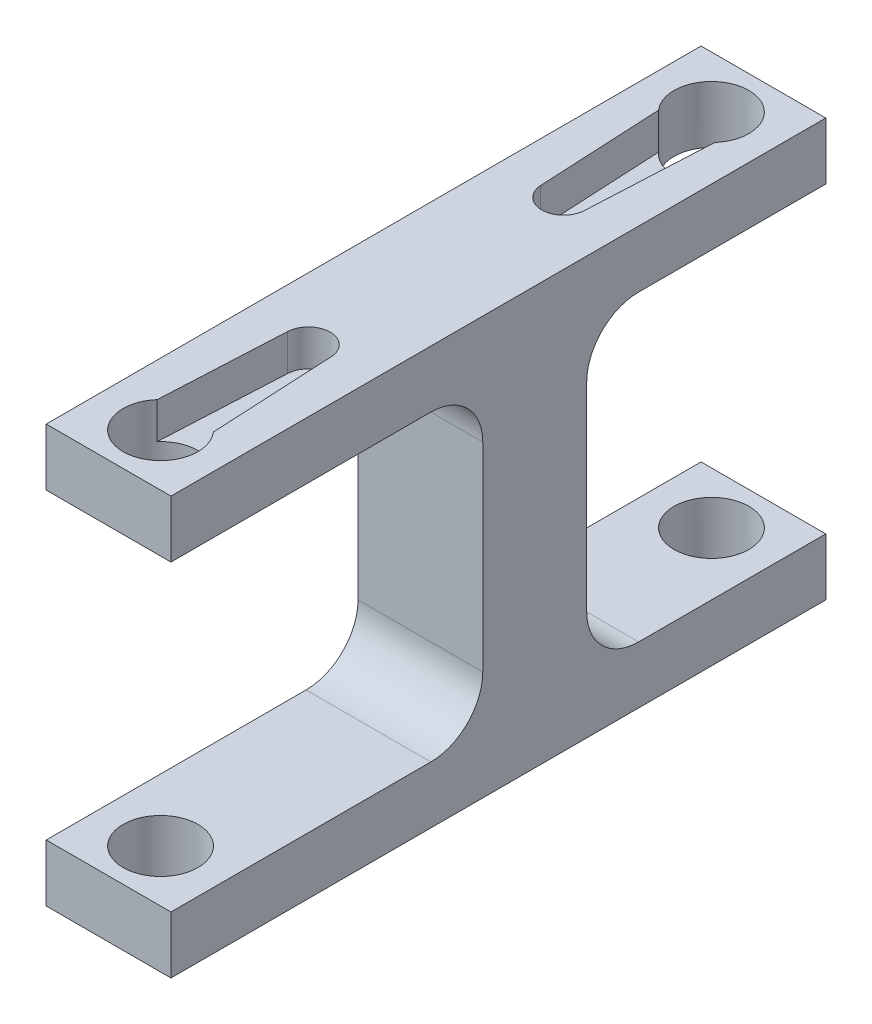
ISO-10303-21;
HEADER;
FILE_DESCRIPTION(('STEP AP214'),'2;1');
FILE_NAME('part.step','',(''),(''),'','','');
FILE_SCHEMA(('AUTOMOTIVE_DESIGN { 1 0 10303 214 1 1 1 1 }'));
ENDSEC;
DATA;
#1=APPLICATION_CONTEXT('core data for automotive mechanical design processes');
#2=APPLICATION_PROTOCOL_DEFINITION('international standard','automotive_design',2000,#1);
#3=PRODUCT_CONTEXT('',#1,'mechanical');
#4=PRODUCT('Part','Part','',(#3));
#5=PRODUCT_RELATED_PRODUCT_CATEGORY('part','',(#4));
#6=PRODUCT_DEFINITION_FORMATION('','',#4);
#7=PRODUCT_DEFINITION_CONTEXT('part definition',#1,'design');
#8=PRODUCT_DEFINITION('design','',#6,#7);
#9=PRODUCT_DEFINITION_SHAPE('','',#8);
#10=(LENGTH_UNIT() NAMED_UNIT(*) SI_UNIT(.MILLI.,.METRE.));
#11=(NAMED_UNIT(*) PLANE_ANGLE_UNIT() SI_UNIT($,.RADIAN.));
#12=(NAMED_UNIT(*) SI_UNIT($,.STERADIAN.) SOLID_ANGLE_UNIT());
#13=UNCERTAINTY_MEASURE_WITH_UNIT(LENGTH_MEASURE(1.E-05),#10,'distance_accuracy_value','');
#14=(GEOMETRIC_REPRESENTATION_CONTEXT(3) GLOBAL_UNCERTAINTY_ASSIGNED_CONTEXT((#13)) GLOBAL_UNIT_ASSIGNED_CONTEXT((#10,
#11,#12)) REPRESENTATION_CONTEXT('',''));
#15=CARTESIAN_POINT('',(0.,0.,0.));
#16=DIRECTION('',(0.,0.,1.));
#17=DIRECTION('',(1.,0.,0.));
#18=AXIS2_PLACEMENT_3D('',#15,#16,#17);
#19=CARTESIAN_POINT('',(0.,0.,-7.5));
#20=DIRECTION('',(0.,0.,-1.));
#21=DIRECTION('',(-1.,0.,0.));
#22=AXIS2_PLACEMENT_3D('',#19,#20,#21);
#23=PLANE('',#22);
#24=DIRECTION('',(0.,-1.,0.));
#25=VECTOR('',#24,1.);
#26=CARTESIAN_POINT('',(3.38839891031811,0.966548743541004,-7.5));
#27=LINE('',#26,#25);
#28=CARTESIAN_POINT('',(3.38839891031811,-9.53345125645899,-7.5));
#29=VERTEX_POINT('',#28);
#30=CARTESIAN_POINT('',(3.38839891031811,-28.683451256459,-7.5));
#31=VERTEX_POINT('',#30);
#32=EDGE_CURVE('E276',#29,#31,#27,.T.);
#33=ORIENTED_EDGE('',*,*,#32,.T.);
#34=DIRECTION('',(1.,0.,0.));
#35=VECTOR('',#34,1.);
#36=CARTESIAN_POINT('',(0.,-28.683451256459,-7.5));
#37=LINE('',#36,#35);
#38=CARTESIAN_POINT('',(-8.61160108968189,-28.683451256459,-7.5));
#39=VERTEX_POINT('',#38);
#40=EDGE_CURVE('E59',#31,#39,#37,.F.);
#41=ORIENTED_EDGE('',*,*,#40,.T.);
#42=DIRECTION('',(0.,1.,0.));
#43=VECTOR('',#42,1.);
#44=CARTESIAN_POINT('',(-8.61160108968189,0.966548743541004,-7.5));
#45=LINE('',#44,#43);
#46=CARTESIAN_POINT('',(-8.61160108968189,-9.53345125645899,-7.5));
#47=VERTEX_POINT('',#46);
#48=EDGE_CURVE('E278',#39,#47,#45,.T.);
#49=ORIENTED_EDGE('',*,*,#48,.T.);
#50=DIRECTION('',(-1.,0.,0.));
#51=VECTOR('',#50,1.);
#52=CARTESIAN_POINT('',(0.,-9.53345125645899,-7.5));
#53=LINE('',#52,#51);
#54=EDGE_CURVE('E377',#47,#29,#53,.F.);
#55=ORIENTED_EDGE('',*,*,#54,.T.);
#56=EDGE_LOOP('',(#33,#41,#49,#55));
#57=FACE_BOUND('',#56,.T.);
#58=ADVANCED_FACE('F38',(#57),#23,.T.);
#59=CARTESIAN_POINT('',(0.,0.,2.5));
#60=DIRECTION('',(0.,0.,1.));
#61=DIRECTION('',(1.,0.,0.));
#62=AXIS2_PLACEMENT_3D('',#59,#60,#61);
#63=PLANE('',#62);
#64=DIRECTION('',(0.,-1.,0.));
#65=VECTOR('',#64,1.);
#66=CARTESIAN_POINT('',(-8.61160108968189,0.,2.5));
#67=LINE('',#66,#65);
#68=CARTESIAN_POINT('',(-8.61160108968189,-9.53345125645899,2.5));
#69=VERTEX_POINT('',#68);
#70=CARTESIAN_POINT('',(-8.61160108968189,-28.683451256459,2.5));
#71=VERTEX_POINT('',#70);
#72=EDGE_CURVE('E345',#69,#71,#67,.T.);
#73=ORIENTED_EDGE('',*,*,#72,.T.);
#74=DIRECTION('',(-1.,0.,0.));
#75=VECTOR('',#74,1.);
#76=CARTESIAN_POINT('',(0.,-28.683451256459,2.5));
#77=LINE('',#76,#75);
#78=CARTESIAN_POINT('',(3.38839891031811,-28.683451256459,2.5));
#79=VERTEX_POINT('',#78);
#80=EDGE_CURVE('E368',#71,#79,#77,.F.);
#81=ORIENTED_EDGE('',*,*,#80,.T.);
#82=DIRECTION('',(0.,-1.,0.));
#83=VECTOR('',#82,1.);
#84=CARTESIAN_POINT('',(3.38839891031811,0.,2.5));
#85=LINE('',#84,#83);
#86=CARTESIAN_POINT('',(3.38839891031811,-9.53345125645899,2.5));
#87=VERTEX_POINT('',#86);
#88=EDGE_CURVE('E342',#87,#79,#85,.T.);
#89=ORIENTED_EDGE('',*,*,#88,.F.);
#90=DIRECTION('',(1.,0.,0.));
#91=VECTOR('',#90,1.);
#92=CARTESIAN_POINT('',(0.,-9.53345125645899,2.5));
#93=LINE('',#92,#91);
#94=EDGE_CURVE('E359',#87,#69,#93,.F.);
#95=ORIENTED_EDGE('',*,*,#94,.T.);
#96=EDGE_LOOP('',(#73,#81,#89,#95));
#97=FACE_BOUND('',#96,.T.);
#98=ADVANCED_FACE('F412',(#97),#63,.T.);
#99=CARTESIAN_POINT('',(3.38839891031811,0.,2.5));
#100=DIRECTION('',(1.,0.,0.));
#101=DIRECTION('',(0.,1.,0.));
#102=AXIS2_PLACEMENT_3D('',#99,#100,#101);
#103=PLANE('',#102);
#104=DIRECTION('',(0.,0.,-1.));
#105=VECTOR('',#104,1.);
#106=CARTESIAN_POINT('',(3.38839891031812,-39.183451256459,2.5));
#107=LINE('',#106,#105);
#108=CARTESIAN_POINT('',(3.38839891031811,-39.183451256459,32.5));
#109=VERTEX_POINT('',#108);
#110=CARTESIAN_POINT('',(3.3883989103181,-39.183451256459,-30.5));
#111=VERTEX_POINT('',#110);
#112=EDGE_CURVE('E348',#109,#111,#107,.T.);
#113=ORIENTED_EDGE('',*,*,#112,.T.);
#114=DIRECTION('',(0.,-1.,0.));
#115=VECTOR('',#114,1.);
#116=CARTESIAN_POINT('',(3.3883989103181,-39.183451256459,-30.5));
#117=LINE('',#116,#115);
#118=CARTESIAN_POINT('',(3.3883989103181,-33.683451256459,-30.5));
#119=VERTEX_POINT('',#118);
#120=EDGE_CURVE('E219',#119,#111,#117,.T.);
#121=ORIENTED_EDGE('',*,*,#120,.F.);
#122=DIRECTION('',(0.,0.,1.));
#123=VECTOR('',#122,1.);
#124=CARTESIAN_POINT('',(3.3883989103181,-33.683451256459,-30.5));
#125=LINE('',#124,#123);
#126=CARTESIAN_POINT('',(3.3883989103181,-33.683451256459,-12.5));
#127=VERTEX_POINT('',#126);
#128=EDGE_CURVE('E254',#119,#127,#125,.T.);
#129=ORIENTED_EDGE('',*,*,#128,.T.);
#130=CARTESIAN_POINT('',(3.38839891031811,-28.683451256459,-12.5));
#131=DIRECTION('',(1.,0.,0.));
#132=DIRECTION('',(0.,1.,0.));
#133=AXIS2_PLACEMENT_3D('',#130,#131,#132);
#134=CIRCLE('',#133,5.);
#135=EDGE_CURVE('E46',#127,#31,#134,.F.);
#136=ORIENTED_EDGE('',*,*,#135,.T.);
#137=ORIENTED_EDGE('',*,*,#32,.F.);
#138=CARTESIAN_POINT('',(3.38839891031811,-9.53345125645899,-12.5));
#139=DIRECTION('',(1.,0.,0.));
#140=DIRECTION('',(0.,1.,0.));
#141=AXIS2_PLACEMENT_3D('',#138,#139,#140);
#142=CIRCLE('',#141,5.);
#143=CARTESIAN_POINT('',(3.38839891031811,-4.533451256459,-12.5));
#144=VERTEX_POINT('',#143);
#145=EDGE_CURVE('E382',#29,#144,#142,.F.);
#146=ORIENTED_EDGE('',*,*,#145,.T.);
#147=DIRECTION('',(0.,0.,1.));
#148=VECTOR('',#147,1.);
#149=CARTESIAN_POINT('',(3.38839891031811,-4.533451256459,-30.5));
#150=LINE('',#149,#148);
#151=CARTESIAN_POINT('',(3.38839891031811,-4.533451256459,-30.5));
#152=VERTEX_POINT('',#151);
#153=EDGE_CURVE('E273',#152,#144,#150,.T.);
#154=ORIENTED_EDGE('',*,*,#153,.F.);
#155=DIRECTION('',(0.,-1.,0.));
#156=VECTOR('',#155,1.);
#157=CARTESIAN_POINT('',(3.38839891031811,0.966548743541004,-30.5));
#158=LINE('',#157,#156);
#159=CARTESIAN_POINT('',(3.38839891031811,0.966548743541004,-30.5));
#160=VERTEX_POINT('',#159);
#161=EDGE_CURVE('E259',#160,#152,#158,.T.);
#162=ORIENTED_EDGE('',*,*,#161,.F.);
#163=DIRECTION('',(0.,0.,-1.));
#164=VECTOR('',#163,1.);
#165=CARTESIAN_POINT('',(3.38839891031811,0.966548743541004,2.5));
#166=LINE('',#165,#164);
#167=CARTESIAN_POINT('',(3.38839891031811,0.966548743541004,32.5));
#168=VERTEX_POINT('',#167);
#169=EDGE_CURVE('E354',#168,#160,#166,.T.);
#170=ORIENTED_EDGE('',*,*,#169,.F.);
#171=DIRECTION('',(0.,1.,0.));
#172=VECTOR('',#171,1.);
#173=CARTESIAN_POINT('',(3.38839891031811,0.966548743541004,32.5));
#174=LINE('',#173,#172);
#175=CARTESIAN_POINT('',(3.38839891031811,-4.533451256459,32.5));
#176=VERTEX_POINT('',#175);
#177=EDGE_CURVE('E330',#176,#168,#174,.T.);
#178=ORIENTED_EDGE('',*,*,#177,.F.);
#179=DIRECTION('',(0.,0.,-1.));
#180=VECTOR('',#179,1.);
#181=CARTESIAN_POINT('',(3.38839891031811,-4.533451256459,32.5));
#182=LINE('',#181,#180);
#183=CARTESIAN_POINT('',(3.38839891031811,-4.533451256459,7.5));
#184=VERTEX_POINT('',#183);
#185=EDGE_CURVE('E336',#176,#184,#182,.T.);
#186=ORIENTED_EDGE('',*,*,#185,.T.);
#187=CARTESIAN_POINT('',(3.38839891031811,-9.53345125645899,7.5));
#188=DIRECTION('',(1.,0.,0.));
#189=DIRECTION('',(0.,1.,0.));
#190=AXIS2_PLACEMENT_3D('',#187,#188,#189);
#191=CIRCLE('',#190,5.);
#192=EDGE_CURVE('E361',#184,#87,#191,.F.);
#193=ORIENTED_EDGE('',*,*,#192,.T.);
#194=ORIENTED_EDGE('',*,*,#88,.T.);
#195=CARTESIAN_POINT('',(3.38839891031811,-28.683451256459,7.5));
#196=DIRECTION('',(1.,0.,0.));
#197=DIRECTION('',(0.,1.,0.));
#198=AXIS2_PLACEMENT_3D('',#195,#196,#197);
#199=CIRCLE('',#198,5.);
#200=CARTESIAN_POINT('',(3.38839891031811,-33.683451256459,7.5));
#201=VERTEX_POINT('',#200);
#202=EDGE_CURVE('E372',#79,#201,#199,.F.);
#203=ORIENTED_EDGE('',*,*,#202,.T.);
#204=DIRECTION('',(0.,0.,-1.));
#205=VECTOR('',#204,1.);
#206=CARTESIAN_POINT('',(3.38839891031811,-33.683451256459,32.5));
#207=LINE('',#206,#205);
#208=CARTESIAN_POINT('',(3.38839891031811,-33.683451256459,32.5));
#209=VERTEX_POINT('',#208);
#210=EDGE_CURVE('E322',#209,#201,#207,.T.);
#211=ORIENTED_EDGE('',*,*,#210,.F.);
#212=DIRECTION('',(0.,1.,0.));
#213=VECTOR('',#212,1.);
#214=CARTESIAN_POINT('',(3.38839891031811,-39.183451256459,32.5));
#215=LINE('',#214,#213);
#216=EDGE_CURVE('E315',#109,#209,#215,.T.);
#217=ORIENTED_EDGE('',*,*,#216,.F.);
#218=EDGE_LOOP('',(#113,#121,#129,#136,#137,#146,#154,#162,#170,#178,#186,#193,#194,#203,#211,#217));
#219=FACE_BOUND('',#218,.T.);
#220=ADVANCED_FACE('F396',(#219),#103,.T.);
#221=CARTESIAN_POINT('',(0.,0.966548743541004,2.5));
#222=DIRECTION('',(0.,1.,0.));
#223=DIRECTION('',(0.,0.,1.));
#224=AXIS2_PLACEMENT_3D('',#221,#222,#223);
#225=PLANE('',#224);
#226=CARTESIAN_POINT('',(-2.61160108968189,0.966548743541004,-25.5));
#227=DIRECTION('',(0.,1.,0.));
#228=DIRECTION('',(0.,0.,1.));
#229=AXIS2_PLACEMENT_3D('',#226,#227,#228);
#230=CIRCLE('',#229,3.6);
#231=CARTESIAN_POINT('',(0.088398910318118,0.966548743541004,-23.1188238200419));
#232=VERTEX_POINT('',#231);
#233=CARTESIAN_POINT('',(-5.31160108968188,0.966548743541004,-23.1188238200419));
#234=VERTEX_POINT('',#233);
#235=EDGE_CURVE('E233',#232,#234,#230,.T.);
#236=ORIENTED_EDGE('',*,*,#235,.F.);
#237=DIRECTION('',(0.050368035382124,0.,-0.99873072497633));
#238=VECTOR('',#237,1.);
#239=CARTESIAN_POINT('',(0.088398910318118,0.966548743541004,-23.1188238200419));
#240=LINE('',#239,#238);
#241=CARTESIAN_POINT('',(-0.514266567231549,0.966548743541004,-11.1687740564372));
#242=VERTEX_POINT('',#241);
#243=EDGE_CURVE('E217',#242,#232,#240,.T.);
#244=ORIENTED_EDGE('',*,*,#243,.F.);
#245=CARTESIAN_POINT('',(-2.61160108968184,0.966548743541004,-11.2745469307396));
#246=DIRECTION('',(0.,1.,0.));
#247=DIRECTION('',(0.,0.,1.));
#248=AXIS2_PLACEMENT_3D('',#245,#246,#247);
#249=CIRCLE('',#248,2.1);
#250=CARTESIAN_POINT('',(-4.70893561213213,0.966548743541004,-11.1687740564372));
#251=VERTEX_POINT('',#250);
#252=EDGE_CURVE('E239',#251,#242,#249,.T.);
#253=ORIENTED_EDGE('',*,*,#252,.F.);
#254=DIRECTION('',(0.050368035382131,0.,0.998730724976329));
#255=VECTOR('',#254,1.);
#256=CARTESIAN_POINT('',(-4.70893561213213,0.966548743541004,-11.1687740564372));
#257=LINE('',#256,#255);
#258=EDGE_CURVE('E235',#234,#251,#257,.T.);
#259=ORIENTED_EDGE('',*,*,#258,.F.);
#260=EDGE_LOOP('',(#236,#244,#253,#259));
#261=FACE_BOUND('',#260,.T.);
#262=CARTESIAN_POINT('',(-2.61160108968189,0.966548743541004,27.5));
#263=DIRECTION('',(0.,1.,0.));
#264=DIRECTION('',(0.,0.,1.));
#265=AXIS2_PLACEMENT_3D('',#262,#263,#264);
#266=CIRCLE('',#265,3.6);
#267=CARTESIAN_POINT('',(-5.31160108968192,0.966548743541004,25.1188238200419));
#268=VERTEX_POINT('',#267);
#269=CARTESIAN_POINT('',(0.0883989103180828,0.966548743541004,25.1188238200418));
#270=VERTEX_POINT('',#269);
#271=EDGE_CURVE('E280',#268,#270,#266,.T.);
#272=ORIENTED_EDGE('',*,*,#271,.F.);
#273=DIRECTION('',(-0.0503680353821171,0.,0.99873072497633));
#274=VECTOR('',#273,1.);
#275=CARTESIAN_POINT('',(-5.31160108968192,0.966548743541004,25.1188238200419));
#276=LINE('',#275,#274);
#277=CARTESIAN_POINT('',(-4.70893561213234,0.966548743541004,13.1687740564373));
#278=VERTEX_POINT('',#277);
#279=EDGE_CURVE('E285',#278,#268,#276,.T.);
#280=ORIENTED_EDGE('',*,*,#279,.F.);
#281=CARTESIAN_POINT('',(-2.61160108968204,0.966548743541004,13.2745469307397));
#282=DIRECTION('',(0.,1.,0.));
#283=DIRECTION('',(0.,0.,1.));
#284=AXIS2_PLACEMENT_3D('',#281,#282,#283);
#285=CIRCLE('',#284,2.1);
#286=CARTESIAN_POINT('',(-0.514266567231752,0.966548743541004,13.1687740564372));
#287=VERTEX_POINT('',#286);
#288=EDGE_CURVE('E296',#287,#278,#285,.T.);
#289=ORIENTED_EDGE('',*,*,#288,.F.);
#290=DIRECTION('',(-0.0503680353821383,0.,-0.998730724976329));
#291=VECTOR('',#290,1.);
#292=CARTESIAN_POINT('',(-0.514266567231752,0.966548743541004,13.1687740564372));
#293=LINE('',#292,#291);
#294=EDGE_CURVE('E293',#270,#287,#293,.T.);
#295=ORIENTED_EDGE('',*,*,#294,.F.);
#296=EDGE_LOOP('',(#272,#280,#289,#295));
#297=FACE_BOUND('',#296,.T.);
#298=ORIENTED_EDGE('',*,*,#169,.T.);
#299=DIRECTION('',(1.,0.,0.));
#300=VECTOR('',#299,1.);
#301=CARTESIAN_POINT('',(3.38839891031811,0.966548743541004,-30.5));
#302=LINE('',#301,#300);
#303=CARTESIAN_POINT('',(-8.61160108968189,0.966548743541004,-30.5));
#304=VERTEX_POINT('',#303);
#305=EDGE_CURVE('E267',#304,#160,#302,.T.);
#306=ORIENTED_EDGE('',*,*,#305,.F.);
#307=DIRECTION('',(0.,0.,-1.));
#308=VECTOR('',#307,1.);
#309=CARTESIAN_POINT('',(-8.61160108968189,0.966548743541004,2.5));
#310=LINE('',#309,#308);
#311=CARTESIAN_POINT('',(-8.61160108968189,0.966548743541004,32.5));
#312=VERTEX_POINT('',#311);
#313=EDGE_CURVE('E352',#312,#304,#310,.T.);
#314=ORIENTED_EDGE('',*,*,#313,.F.);
#315=DIRECTION('',(-1.,0.,0.));
#316=VECTOR('',#315,1.);
#317=CARTESIAN_POINT('',(-8.61160108968189,0.966548743541004,32.5));
#318=LINE('',#317,#316);
#319=EDGE_CURVE('E333',#168,#312,#318,.T.);
#320=ORIENTED_EDGE('',*,*,#319,.F.);
#321=EDGE_LOOP('',(#298,#306,#314,#320));
#322=FACE_BOUND('',#321,.T.);
#323=ADVANCED_FACE('F465',(#261,#297,#322),#225,.T.);
#324=CARTESIAN_POINT('',(-8.61160108968189,0.,2.5));
#325=DIRECTION('',(1.,0.,0.));
#326=DIRECTION('',(0.,1.,0.));
#327=AXIS2_PLACEMENT_3D('',#324,#325,#326);
#328=PLANE('',#327);
#329=ORIENTED_EDGE('',*,*,#313,.T.);
#330=DIRECTION('',(0.,1.,0.));
#331=VECTOR('',#330,1.);
#332=CARTESIAN_POINT('',(-8.61160108968189,0.966548743541004,-30.5));
#333=LINE('',#332,#331);
#334=CARTESIAN_POINT('',(-8.61160108968189,-4.53345125645899,-30.5));
#335=VERTEX_POINT('',#334);
#336=EDGE_CURVE('E264',#335,#304,#333,.T.);
#337=ORIENTED_EDGE('',*,*,#336,.F.);
#338=DIRECTION('',(0.,0.,1.));
#339=VECTOR('',#338,1.);
#340=CARTESIAN_POINT('',(-8.61160108968189,-4.53345125645899,-30.5));
#341=LINE('',#340,#339);
#342=CARTESIAN_POINT('',(-8.61160108968189,-4.53345125645899,-12.5));
#343=VERTEX_POINT('',#342);
#344=EDGE_CURVE('E270',#335,#343,#341,.T.);
#345=ORIENTED_EDGE('',*,*,#344,.T.);
#346=CARTESIAN_POINT('',(-8.61160108968189,-9.53345125645899,-12.5));
#347=DIRECTION('',(1.,0.,0.));
#348=DIRECTION('',(0.,1.,0.));
#349=AXIS2_PLACEMENT_3D('',#346,#347,#348);
#350=CIRCLE('',#349,5.);
#351=EDGE_CURVE('E379',#343,#47,#350,.T.);
#352=ORIENTED_EDGE('',*,*,#351,.T.);
#353=ORIENTED_EDGE('',*,*,#48,.F.);
#354=CARTESIAN_POINT('',(-8.61160108968189,-28.683451256459,-12.5));
#355=DIRECTION('',(1.,0.,0.));
#356=DIRECTION('',(0.,1.,0.));
#357=AXIS2_PLACEMENT_3D('',#354,#355,#356);
#358=CIRCLE('',#357,5.);
#359=CARTESIAN_POINT('',(-8.61160108968189,-33.683451256459,-12.5));
#360=VERTEX_POINT('',#359);
#361=EDGE_CURVE('E11',#39,#360,#358,.T.);
#362=ORIENTED_EDGE('',*,*,#361,.T.);
#363=DIRECTION('',(0.,0.,1.));
#364=VECTOR('',#363,1.);
#365=CARTESIAN_POINT('',(-8.61160108968189,-33.683451256459,-30.5));
#366=LINE('',#365,#364);
#367=CARTESIAN_POINT('',(-8.61160108968189,-33.683451256459,-30.5));
#368=VERTEX_POINT('',#367);
#369=EDGE_CURVE('E256',#368,#360,#366,.T.);
#370=ORIENTED_EDGE('',*,*,#369,.F.);
#371=DIRECTION('',(0.,1.,0.));
#372=VECTOR('',#371,1.);
#373=CARTESIAN_POINT('',(-8.61160108968189,-39.183451256459,-30.5));
#374=LINE('',#373,#372);
#375=CARTESIAN_POINT('',(-8.61160108968189,-39.183451256459,-30.5));
#376=VERTEX_POINT('',#375);
#377=EDGE_CURVE('E250',#376,#368,#374,.T.);
#378=ORIENTED_EDGE('',*,*,#377,.F.);
#379=DIRECTION('',(0.,0.,-1.));
#380=VECTOR('',#379,1.);
#381=CARTESIAN_POINT('',(-8.61160108968189,-39.183451256459,2.5));
#382=LINE('',#381,#380);
#383=CARTESIAN_POINT('',(-8.61160108968189,-39.183451256459,32.5));
#384=VERTEX_POINT('',#383);
#385=EDGE_CURVE('E350',#384,#376,#382,.T.);
#386=ORIENTED_EDGE('',*,*,#385,.F.);
#387=DIRECTION('',(0.,-1.,0.));
#388=VECTOR('',#387,1.);
#389=CARTESIAN_POINT('',(-8.61160108968189,-39.183451256459,32.5));
#390=LINE('',#389,#388);
#391=CARTESIAN_POINT('',(-8.61160108968189,-33.683451256459,32.5));
#392=VERTEX_POINT('',#391);
#393=EDGE_CURVE('E303',#392,#384,#390,.T.);
#394=ORIENTED_EDGE('',*,*,#393,.F.);
#395=DIRECTION('',(0.,0.,-1.));
#396=VECTOR('',#395,1.);
#397=CARTESIAN_POINT('',(-8.61160108968189,-33.683451256459,32.5));
#398=LINE('',#397,#396);
#399=CARTESIAN_POINT('',(-8.61160108968189,-33.683451256459,7.5));
#400=VERTEX_POINT('',#399);
#401=EDGE_CURVE('E319',#392,#400,#398,.T.);
#402=ORIENTED_EDGE('',*,*,#401,.T.);
#403=CARTESIAN_POINT('',(-8.61160108968189,-28.683451256459,7.5));
#404=DIRECTION('',(1.,0.,0.));
#405=DIRECTION('',(0.,1.,0.));
#406=AXIS2_PLACEMENT_3D('',#403,#404,#405);
#407=CIRCLE('',#406,5.);
#408=EDGE_CURVE('E370',#400,#71,#407,.T.);
#409=ORIENTED_EDGE('',*,*,#408,.T.);
#410=ORIENTED_EDGE('',*,*,#72,.F.);
#411=CARTESIAN_POINT('',(-8.61160108968189,-9.53345125645899,7.5));
#412=DIRECTION('',(1.,0.,0.));
#413=DIRECTION('',(0.,1.,0.));
#414=AXIS2_PLACEMENT_3D('',#411,#412,#413);
#415=CIRCLE('',#414,5.);
#416=CARTESIAN_POINT('',(-8.61160108968189,-4.533451256459,7.5));
#417=VERTEX_POINT('',#416);
#418=EDGE_CURVE('E363',#69,#417,#415,.T.);
#419=ORIENTED_EDGE('',*,*,#418,.T.);
#420=DIRECTION('',(0.,0.,-1.));
#421=VECTOR('',#420,1.);
#422=CARTESIAN_POINT('',(-8.61160108968189,-4.533451256459,32.5));
#423=LINE('',#422,#421);
#424=CARTESIAN_POINT('',(-8.61160108968189,-4.533451256459,32.5));
#425=VERTEX_POINT('',#424);
#426=EDGE_CURVE('E339',#425,#417,#423,.T.);
#427=ORIENTED_EDGE('',*,*,#426,.F.);
#428=DIRECTION('',(0.,-1.,0.));
#429=VECTOR('',#428,1.);
#430=CARTESIAN_POINT('',(-8.61160108968189,0.966548743541004,32.5));
#431=LINE('',#430,#429);
#432=EDGE_CURVE('E325',#312,#425,#431,.T.);
#433=ORIENTED_EDGE('',*,*,#432,.F.);
#434=EDGE_LOOP('',(#329,#337,#345,#352,#353,#362,#370,#378,#386,#394,#402,#409,#410,#419,#427,#433));
#435=FACE_BOUND('',#434,.T.);
#436=ADVANCED_FACE('F403',(#435),#328,.F.);
#437=CARTESIAN_POINT('',(0.,-39.183451256459,2.5));
#438=DIRECTION('',(0.,1.,0.));
#439=DIRECTION('',(0.,0.,1.));
#440=AXIS2_PLACEMENT_3D('',#437,#438,#439);
#441=PLANE('',#440);
#442=CARTESIAN_POINT('',(-2.61160108968189,-39.183451256459,-25.5));
#443=DIRECTION('',(0.,1.,0.));
#444=DIRECTION('',(0.,0.,1.));
#445=AXIS2_PLACEMENT_3D('',#442,#443,#444);
#446=CIRCLE('',#445,3.6);
#447=CARTESIAN_POINT('',(-2.61160108968189,-39.183451256459,-21.9));
#448=VERTEX_POINT('',#447);
#449=EDGE_CURVE('E528',#448,#448,#446,.T.);
#450=ORIENTED_EDGE('',*,*,#449,.T.);
#451=EDGE_LOOP('',(#450));
#452=FACE_BOUND('',#451,.T.);
#453=CARTESIAN_POINT('',(-2.61160108968189,-39.183451256459,27.5));
#454=DIRECTION('',(0.,1.,0.));
#455=DIRECTION('',(0.,0.,1.));
#456=AXIS2_PLACEMENT_3D('',#453,#454,#455);
#457=CIRCLE('',#456,3.6);
#458=CARTESIAN_POINT('',(-2.61160108968189,-39.183451256459,31.1));
#459=VERTEX_POINT('',#458);
#460=EDGE_CURVE('E521',#459,#459,#457,.T.);
#461=ORIENTED_EDGE('',*,*,#460,.T.);
#462=EDGE_LOOP('',(#461));
#463=FACE_BOUND('',#462,.T.);
#464=ORIENTED_EDGE('',*,*,#385,.T.);
#465=DIRECTION('',(-1.,0.,0.));
#466=VECTOR('',#465,1.);
#467=CARTESIAN_POINT('',(3.3883989103181,-39.183451256459,-30.5));
#468=LINE('',#467,#466);
#469=EDGE_CURVE('E247',#111,#376,#468,.T.);
#470=ORIENTED_EDGE('',*,*,#469,.F.);
#471=ORIENTED_EDGE('',*,*,#112,.F.);
#472=DIRECTION('',(1.,0.,0.));
#473=VECTOR('',#472,1.);
#474=CARTESIAN_POINT('',(-8.61160108968189,-39.183451256459,32.5));
#475=LINE('',#474,#473);
#476=EDGE_CURVE('E312',#384,#109,#475,.T.);
#477=ORIENTED_EDGE('',*,*,#476,.F.);
#478=EDGE_LOOP('',(#464,#470,#471,#477));
#479=FACE_BOUND('',#478,.T.);
#480=ADVANCED_FACE('F457',(#452,#463,#479),#441,.F.);
#481=CARTESIAN_POINT('',(-8.61160108968189,-4.533451256459,32.5));
#482=DIRECTION('',(0.,1.,0.));
#483=DIRECTION('',(0.,0.,1.));
#484=AXIS2_PLACEMENT_3D('',#481,#482,#483);
#485=PLANE('',#484);
#486=CARTESIAN_POINT('',(-2.61160108968189,-4.53345125645899,27.5));
#487=DIRECTION('',(0.,1.,0.));
#488=DIRECTION('',(0.,0.,1.));
#489=AXIS2_PLACEMENT_3D('',#486,#487,#488);
#490=CIRCLE('',#489,3.6);
#491=CARTESIAN_POINT('',(-2.61160108968189,-4.53345125645899,31.1));
#492=VERTEX_POINT('',#491);
#493=EDGE_CURVE('E236',#492,#492,#490,.T.);
#494=ORIENTED_EDGE('',*,*,#493,.T.);
#495=EDGE_LOOP('',(#494));
#496=FACE_BOUND('',#495,.T.);
#497=ORIENTED_EDGE('',*,*,#426,.T.);
#498=DIRECTION('',(1.,0.,0.));
#499=VECTOR('',#498,1.);
#500=CARTESIAN_POINT('',(-8.61160108968189,-4.533451256459,7.5));
#501=LINE('',#500,#499);
#502=EDGE_CURVE('E209',#417,#184,#501,.T.);
#503=ORIENTED_EDGE('',*,*,#502,.T.);
#504=ORIENTED_EDGE('',*,*,#185,.F.);
#505=DIRECTION('',(1.,0.,0.));
#506=VECTOR('',#505,1.);
#507=CARTESIAN_POINT('',(-8.61160108968189,-4.533451256459,32.5));
#508=LINE('',#507,#506);
#509=EDGE_CURVE('E328',#425,#176,#508,.T.);
#510=ORIENTED_EDGE('',*,*,#509,.F.);
#511=EDGE_LOOP('',(#497,#503,#504,#510));
#512=FACE_BOUND('',#511,.T.);
#513=ADVANCED_FACE('F454',(#496,#512),#485,.F.);
#514=CARTESIAN_POINT('',(0.,0.,32.5));
#515=DIRECTION('',(0.,0.,1.));
#516=DIRECTION('',(1.,0.,0.));
#517=AXIS2_PLACEMENT_3D('',#514,#515,#516);
#518=PLANE('',#517);
#519=ORIENTED_EDGE('',*,*,#432,.T.);
#520=ORIENTED_EDGE('',*,*,#509,.T.);
#521=ORIENTED_EDGE('',*,*,#177,.T.);
#522=ORIENTED_EDGE('',*,*,#319,.T.);
#523=EDGE_LOOP('',(#519,#520,#521,#522));
#524=FACE_BOUND('',#523,.T.);
#525=ADVANCED_FACE('F450',(#524),#518,.T.);
#526=CARTESIAN_POINT('',(-8.61160108968189,-33.683451256459,32.5));
#527=DIRECTION('',(0.,-1.,0.));
#528=DIRECTION('',(0.,0.,-1.));
#529=AXIS2_PLACEMENT_3D('',#526,#527,#528);
#530=PLANE('',#529);
#531=CARTESIAN_POINT('',(-2.61160108968189,-33.683451256459,27.5));
#532=DIRECTION('',(0.,-1.,0.));
#533=DIRECTION('',(0.,0.,-1.));
#534=AXIS2_PLACEMENT_3D('',#531,#532,#533);
#535=CIRCLE('',#534,3.6);
#536=CARTESIAN_POINT('',(-2.61160108968189,-33.683451256459,23.9));
#537=VERTEX_POINT('',#536);
#538=EDGE_CURVE('E525',#537,#537,#535,.T.);
#539=ORIENTED_EDGE('',*,*,#538,.T.);
#540=EDGE_LOOP('',(#539));
#541=FACE_BOUND('',#540,.T.);
#542=ORIENTED_EDGE('',*,*,#210,.T.);
#543=DIRECTION('',(-1.,0.,0.));
#544=VECTOR('',#543,1.);
#545=CARTESIAN_POINT('',(-8.61160108968189,-33.683451256459,7.5));
#546=LINE('',#545,#544);
#547=EDGE_CURVE('E365',#201,#400,#546,.T.);
#548=ORIENTED_EDGE('',*,*,#547,.T.);
#549=ORIENTED_EDGE('',*,*,#401,.F.);
#550=DIRECTION('',(-1.,0.,0.));
#551=VECTOR('',#550,1.);
#552=CARTESIAN_POINT('',(-8.61160108968189,-33.683451256459,32.5));
#553=LINE('',#552,#551);
#554=EDGE_CURVE('E317',#209,#392,#553,.T.);
#555=ORIENTED_EDGE('',*,*,#554,.F.);
#556=EDGE_LOOP('',(#542,#548,#549,#555));
#557=FACE_BOUND('',#556,.T.);
#558=ADVANCED_FACE('F446',(#541,#557),#530,.F.);
#559=CARTESIAN_POINT('',(0.,0.,32.5));
#560=DIRECTION('',(0.,0.,-1.));
#561=DIRECTION('',(-1.,0.,0.));
#562=AXIS2_PLACEMENT_3D('',#559,#560,#561);
#563=PLANE('',#562);
#564=ORIENTED_EDGE('',*,*,#393,.T.);
#565=ORIENTED_EDGE('',*,*,#476,.T.);
#566=ORIENTED_EDGE('',*,*,#216,.T.);
#567=ORIENTED_EDGE('',*,*,#554,.T.);
#568=EDGE_LOOP('',(#564,#565,#566,#567));
#569=FACE_BOUND('',#568,.T.);
#570=ADVANCED_FACE('F442',(#569),#563,.F.);
#571=CARTESIAN_POINT('',(-2.61160108968189,-2.533451256459,27.5));
#572=DIRECTION('',(0.,1.,0.));
#573=DIRECTION('',(0.,0.,1.));
#574=AXIS2_PLACEMENT_3D('',#571,#572,#573);
#575=CYLINDRICAL_SURFACE('',#574,3.6);
#576=ORIENTED_EDGE('',*,*,#271,.T.);
#577=DIRECTION('',(0.,1.,0.));
#578=VECTOR('',#577,1.);
#579=CARTESIAN_POINT('',(0.0883989103180827,-2.533451256459,25.1188238200418));
#580=LINE('',#579,#578);
#581=CARTESIAN_POINT('',(0.0883989103180813,-2.533451256459,25.1188238200418));
#582=VERTEX_POINT('',#581);
#583=EDGE_CURVE('E291',#582,#270,#580,.T.);
#584=ORIENTED_EDGE('',*,*,#583,.F.);
#585=CARTESIAN_POINT('',(-2.61160108968189,-2.533451256459,27.5));
#586=DIRECTION('',(0.,1.,0.));
#587=DIRECTION('',(0.,0.,1.));
#588=AXIS2_PLACEMENT_3D('',#585,#586,#587);
#589=CIRCLE('',#588,3.6);
#590=CARTESIAN_POINT('',(-5.31160108968192,-2.533451256459,25.1188238200419));
#591=VERTEX_POINT('',#590);
#592=EDGE_CURVE('E210',#582,#591,#589,.T.);
#593=ORIENTED_EDGE('',*,*,#592,.T.);
#594=DIRECTION('',(0.,1.,0.));
#595=VECTOR('',#594,1.);
#596=CARTESIAN_POINT('',(-5.31160108968192,-2.533451256459,25.1188238200419));
#597=LINE('',#596,#595);
#598=EDGE_CURVE('E301',#591,#268,#597,.T.);
#599=ORIENTED_EDGE('',*,*,#598,.T.);
#600=EDGE_LOOP('',(#576,#584,#593,#599));
#601=FACE_BOUND('',#600,.T.);
#602=ORIENTED_EDGE('',*,*,#493,.F.);
#603=EDGE_LOOP('',(#602));
#604=FACE_BOUND('',#603,.T.);
#605=ADVANCED_FACE('F432',(#601,#604),#575,.F.);
#606=CARTESIAN_POINT('',(-5.31160108968192,-2.533451256459,25.1188238200419));
#607=DIRECTION('',(-0.99873072497633,0.,-0.0503680353821171));
#608=DIRECTION('',(-0.0503680353821171,0.,0.99873072497633));
#609=AXIS2_PLACEMENT_3D('',#606,#607,#608);
#610=PLANE('',#609);
#611=ORIENTED_EDGE('',*,*,#279,.T.);
#612=ORIENTED_EDGE('',*,*,#598,.F.);
#613=DIRECTION('',(-0.0503680353821171,0.,0.99873072497633));
#614=VECTOR('',#613,1.);
#615=CARTESIAN_POINT('',(-5.31160108968192,-2.533451256459,25.1188238200419));
#616=LINE('',#615,#614);
#617=CARTESIAN_POINT('',(-4.70893561213234,-2.533451256459,13.1687740564373));
#618=VERTEX_POINT('',#617);
#619=EDGE_CURVE('E288',#618,#591,#616,.T.);
#620=ORIENTED_EDGE('',*,*,#619,.F.);
#621=DIRECTION('',(0.,1.,0.));
#622=VECTOR('',#621,1.);
#623=CARTESIAN_POINT('',(-4.70893561213234,-2.533451256459,13.1687740564373));
#624=LINE('',#623,#622);
#625=EDGE_CURVE('E304',#618,#278,#624,.T.);
#626=ORIENTED_EDGE('',*,*,#625,.T.);
#627=EDGE_LOOP('',(#611,#612,#620,#626));
#628=FACE_BOUND('',#627,.T.);
#629=ADVANCED_FACE('F428',(#628),#610,.F.);
#630=CARTESIAN_POINT('',(-2.61160108968204,-2.533451256459,13.2745469307397));
#631=DIRECTION('',(0.,1.,0.));
#632=DIRECTION('',(0.,0.,1.));
#633=AXIS2_PLACEMENT_3D('',#630,#631,#632);
#634=CYLINDRICAL_SURFACE('',#633,2.1);
#635=ORIENTED_EDGE('',*,*,#288,.T.);
#636=ORIENTED_EDGE('',*,*,#625,.F.);
#637=CARTESIAN_POINT('',(-2.61160108968204,-2.533451256459,13.2745469307397));
#638=DIRECTION('',(0.,1.,0.));
#639=DIRECTION('',(0.,0.,1.));
#640=AXIS2_PLACEMENT_3D('',#637,#638,#639);
#641=CIRCLE('',#640,2.1);
#642=CARTESIAN_POINT('',(-0.514266567231752,-2.533451256459,13.1687740564372));
#643=VERTEX_POINT('',#642);
#644=EDGE_CURVE('E284',#643,#618,#641,.T.);
#645=ORIENTED_EDGE('',*,*,#644,.F.);
#646=DIRECTION('',(0.,1.,0.));
#647=VECTOR('',#646,1.);
#648=CARTESIAN_POINT('',(-0.514266567231752,-2.533451256459,13.1687740564372));
#649=LINE('',#648,#647);
#650=EDGE_CURVE('E306',#643,#287,#649,.T.);
#651=ORIENTED_EDGE('',*,*,#650,.T.);
#652=EDGE_LOOP('',(#635,#636,#645,#651));
#653=FACE_BOUND('',#652,.T.);
#654=ADVANCED_FACE('F431',(#653),#634,.F.);
#655=CARTESIAN_POINT('',(-0.514266567231752,-2.533451256459,13.1687740564372));
#656=DIRECTION('',(0.998730724976329,0.,-0.0503680353821383));
#657=DIRECTION('',(-0.0503680353821383,0.,-0.998730724976329));
#658=AXIS2_PLACEMENT_3D('',#655,#656,#657);
#659=PLANE('',#658);
#660=ORIENTED_EDGE('',*,*,#294,.T.);
#661=ORIENTED_EDGE('',*,*,#650,.F.);
#662=DIRECTION('',(-0.0503680353821383,0.,-0.998730724976329));
#663=VECTOR('',#662,1.);
#664=CARTESIAN_POINT('',(-0.514266567231752,-2.533451256459,13.1687740564372));
#665=LINE('',#664,#663);
#666=EDGE_CURVE('E281',#582,#643,#665,.T.);
#667=ORIENTED_EDGE('',*,*,#666,.F.);
#668=ORIENTED_EDGE('',*,*,#583,.T.);
#669=EDGE_LOOP('',(#660,#661,#667,#668));
#670=FACE_BOUND('',#669,.T.);
#671=ADVANCED_FACE('F426',(#670),#659,.F.);
#672=CARTESIAN_POINT('',(-2.61160108968189,-2.533451256459,27.5));
#673=DIRECTION('',(0.,1.,0.));
#674=DIRECTION('',(0.,0.,1.));
#675=AXIS2_PLACEMENT_3D('',#672,#673,#674);
#676=PLANE('',#675);
#677=ORIENTED_EDGE('',*,*,#592,.F.);
#678=ORIENTED_EDGE('',*,*,#666,.T.);
#679=ORIENTED_EDGE('',*,*,#644,.T.);
#680=ORIENTED_EDGE('',*,*,#619,.T.);
#681=EDGE_LOOP('',(#677,#678,#679,#680));
#682=FACE_BOUND('',#681,.T.);
#683=ADVANCED_FACE('F423',(#682),#676,.T.);
#684=CARTESIAN_POINT('',(3.38839891031811,-4.533451256459,-30.5));
#685=DIRECTION('',(0.,1.,0.));
#686=DIRECTION('',(-1.,0.,0.));
#687=AXIS2_PLACEMENT_3D('',#684,#685,#686);
#688=PLANE('',#687);
#689=CARTESIAN_POINT('',(-2.61160108968189,-4.53345125645899,-25.5));
#690=DIRECTION('',(0.,1.,0.));
#691=DIRECTION('',(-1.,0.,0.));
#692=AXIS2_PLACEMENT_3D('',#689,#690,#691);
#693=CIRCLE('',#692,3.6);
#694=CARTESIAN_POINT('',(-6.21160108968189,-4.53345125645899,-25.5));
#695=VERTEX_POINT('',#694);
#696=EDGE_CURVE('E520',#695,#695,#693,.T.);
#697=ORIENTED_EDGE('',*,*,#696,.T.);
#698=EDGE_LOOP('',(#697));
#699=FACE_BOUND('',#698,.T.);
#700=ORIENTED_EDGE('',*,*,#153,.T.);
#701=DIRECTION('',(-1.,0.,0.));
#702=VECTOR('',#701,1.);
#703=CARTESIAN_POINT('',(3.38839891031811,-4.533451256459,-12.5));
#704=LINE('',#703,#702);
#705=EDGE_CURVE('E374',#144,#343,#704,.T.);
#706=ORIENTED_EDGE('',*,*,#705,.T.);
#707=ORIENTED_EDGE('',*,*,#344,.F.);
#708=DIRECTION('',(-1.,0.,0.));
#709=VECTOR('',#708,1.);
#710=CARTESIAN_POINT('',(3.38839891031811,-4.533451256459,-30.5));
#711=LINE('',#710,#709);
#712=EDGE_CURVE('E262',#152,#335,#711,.T.);
#713=ORIENTED_EDGE('',*,*,#712,.F.);
#714=EDGE_LOOP('',(#700,#706,#707,#713));
#715=FACE_BOUND('',#714,.T.);
#716=ADVANCED_FACE('F421',(#699,#715),#688,.F.);
#717=CARTESIAN_POINT('',(0.,0.,-30.5));
#718=DIRECTION('',(0.,0.,-1.));
#719=DIRECTION('',(-1.,0.,0.));
#720=AXIS2_PLACEMENT_3D('',#717,#718,#719);
#721=PLANE('',#720);
#722=ORIENTED_EDGE('',*,*,#161,.T.);
#723=ORIENTED_EDGE('',*,*,#712,.T.);
#724=ORIENTED_EDGE('',*,*,#336,.T.);
#725=ORIENTED_EDGE('',*,*,#305,.T.);
#726=EDGE_LOOP('',(#722,#723,#724,#725));
#727=FACE_BOUND('',#726,.T.);
#728=ADVANCED_FACE('F505',(#727),#721,.T.);
#729=CARTESIAN_POINT('',(3.3883989103181,-33.683451256459,-30.5));
#730=DIRECTION('',(0.,-1.,0.));
#731=DIRECTION('',(0.,0.,-1.));
#732=AXIS2_PLACEMENT_3D('',#729,#730,#731);
#733=PLANE('',#732);
#734=CARTESIAN_POINT('',(-2.61160108968189,-33.683451256459,-25.5));
#735=DIRECTION('',(0.,-1.,0.));
#736=DIRECTION('',(0.,0.,-1.));
#737=AXIS2_PLACEMENT_3D('',#734,#735,#736);
#738=CIRCLE('',#737,3.6);
#739=CARTESIAN_POINT('',(-2.61160108968189,-33.683451256459,-29.1));
#740=VERTEX_POINT('',#739);
#741=EDGE_CURVE('E522',#740,#740,#738,.T.);
#742=ORIENTED_EDGE('',*,*,#741,.T.);
#743=EDGE_LOOP('',(#742));
#744=FACE_BOUND('',#743,.T.);
#745=ORIENTED_EDGE('',*,*,#369,.T.);
#746=DIRECTION('',(1.,0.,0.));
#747=VECTOR('',#746,1.);
#748=CARTESIAN_POINT('',(3.3883989103181,-33.683451256459,-12.5));
#749=LINE('',#748,#747);
#750=EDGE_CURVE('E384',#360,#127,#749,.T.);
#751=ORIENTED_EDGE('',*,*,#750,.T.);
#752=ORIENTED_EDGE('',*,*,#128,.F.);
#753=DIRECTION('',(1.,0.,0.));
#754=VECTOR('',#753,1.);
#755=CARTESIAN_POINT('',(3.3883989103181,-33.683451256459,-30.5));
#756=LINE('',#755,#754);
#757=EDGE_CURVE('E252',#368,#119,#756,.T.);
#758=ORIENTED_EDGE('',*,*,#757,.F.);
#759=EDGE_LOOP('',(#745,#751,#752,#758));
#760=FACE_BOUND('',#759,.T.);
#761=ADVANCED_FACE('F390',(#744,#760),#733,.F.);
#762=CARTESIAN_POINT('',(0.,0.,-30.5));
#763=DIRECTION('',(0.,0.,1.));
#764=DIRECTION('',(1.,0.,0.));
#765=AXIS2_PLACEMENT_3D('',#762,#763,#764);
#766=PLANE('',#765);
#767=ORIENTED_EDGE('',*,*,#120,.T.);
#768=ORIENTED_EDGE('',*,*,#469,.T.);
#769=ORIENTED_EDGE('',*,*,#377,.T.);
#770=ORIENTED_EDGE('',*,*,#757,.T.);
#771=EDGE_LOOP('',(#767,#768,#769,#770));
#772=FACE_BOUND('',#771,.T.);
#773=ADVANCED_FACE('F400',(#772),#766,.F.);
#774=CARTESIAN_POINT('',(-2.61160108968189,-2.533451256459,-25.5));
#775=DIRECTION('',(0.,1.,0.));
#776=DIRECTION('',(0.,0.,1.));
#777=AXIS2_PLACEMENT_3D('',#774,#775,#776);
#778=CYLINDRICAL_SURFACE('',#777,3.6);
#779=ORIENTED_EDGE('',*,*,#235,.T.);
#780=DIRECTION('',(0.,1.,0.));
#781=VECTOR('',#780,1.);
#782=CARTESIAN_POINT('',(-5.31160108968188,-2.533451256459,-23.1188238200419));
#783=LINE('',#782,#781);
#784=CARTESIAN_POINT('',(-5.31160108968188,-2.533451256459,-23.1188238200419));
#785=VERTEX_POINT('',#784);
#786=EDGE_CURVE('E204',#785,#234,#783,.T.);
#787=ORIENTED_EDGE('',*,*,#786,.F.);
#788=CARTESIAN_POINT('',(-2.61160108968189,-2.533451256459,-25.5));
#789=DIRECTION('',(0.,1.,0.));
#790=DIRECTION('',(0.,0.,1.));
#791=AXIS2_PLACEMENT_3D('',#788,#789,#790);
#792=CIRCLE('',#791,3.6);
#793=CARTESIAN_POINT('',(0.0883989103181178,-2.533451256459,-23.1188238200419));
#794=VERTEX_POINT('',#793);
#795=EDGE_CURVE('E197',#785,#794,#792,.T.);
#796=ORIENTED_EDGE('',*,*,#795,.T.);
#797=DIRECTION('',(0.,1.,0.));
#798=VECTOR('',#797,1.);
#799=CARTESIAN_POINT('',(0.088398910318118,-2.533451256459,-23.1188238200419));
#800=LINE('',#799,#798);
#801=EDGE_CURVE('E201',#794,#232,#800,.T.);
#802=ORIENTED_EDGE('',*,*,#801,.T.);
#803=EDGE_LOOP('',(#779,#787,#796,#802));
#804=FACE_BOUND('',#803,.T.);
#805=ORIENTED_EDGE('',*,*,#696,.F.);
#806=EDGE_LOOP('',(#805));
#807=FACE_BOUND('',#806,.T.);
#808=ADVANCED_FACE('F199',(#804,#807),#778,.F.);
#809=CARTESIAN_POINT('',(0.088398910318118,-2.533451256459,-23.1188238200419));
#810=DIRECTION('',(0.99873072497633,0.,0.050368035382124));
#811=DIRECTION('',(0.0503680353821241,0.,-0.99873072497633));
#812=AXIS2_PLACEMENT_3D('',#809,#810,#811);
#813=PLANE('',#812);
#814=ORIENTED_EDGE('',*,*,#243,.T.);
#815=ORIENTED_EDGE('',*,*,#801,.F.);
#816=DIRECTION('',(0.050368035382124,0.,-0.99873072497633));
#817=VECTOR('',#816,1.);
#818=CARTESIAN_POINT('',(0.088398910318118,-2.533451256459,-23.1188238200419));
#819=LINE('',#818,#817);
#820=CARTESIAN_POINT('',(-0.514266567231549,-2.533451256459,-11.1687740564372));
#821=VERTEX_POINT('',#820);
#822=EDGE_CURVE('E215',#821,#794,#819,.T.);
#823=ORIENTED_EDGE('',*,*,#822,.F.);
#824=DIRECTION('',(0.,1.,0.));
#825=VECTOR('',#824,1.);
#826=CARTESIAN_POINT('',(-0.514266567231549,-2.533451256459,-11.1687740564372));
#827=LINE('',#826,#825);
#828=EDGE_CURVE('E220',#821,#242,#827,.T.);
#829=ORIENTED_EDGE('',*,*,#828,.T.);
#830=EDGE_LOOP('',(#814,#815,#823,#829));
#831=FACE_BOUND('',#830,.T.);
#832=ADVANCED_FACE('F214',(#831),#813,.F.);
#833=CARTESIAN_POINT('',(-2.61160108968184,-2.533451256459,-11.2745469307396));
#834=DIRECTION('',(0.,1.,0.));
#835=DIRECTION('',(0.,0.,1.));
#836=AXIS2_PLACEMENT_3D('',#833,#834,#835);
#837=CYLINDRICAL_SURFACE('',#836,2.1);
#838=ORIENTED_EDGE('',*,*,#252,.T.);
#839=ORIENTED_EDGE('',*,*,#828,.F.);
#840=CARTESIAN_POINT('',(-2.61160108968184,-2.533451256459,-11.2745469307396));
#841=DIRECTION('',(0.,1.,0.));
#842=DIRECTION('',(0.,0.,1.));
#843=AXIS2_PLACEMENT_3D('',#840,#841,#842);
#844=CIRCLE('',#843,2.1);
#845=CARTESIAN_POINT('',(-4.70893561213213,-2.533451256459,-11.1687740564372));
#846=VERTEX_POINT('',#845);
#847=EDGE_CURVE('E225',#846,#821,#844,.T.);
#848=ORIENTED_EDGE('',*,*,#847,.F.);
#849=DIRECTION('',(0.,1.,0.));
#850=VECTOR('',#849,1.);
#851=CARTESIAN_POINT('',(-4.70893561213213,-2.533451256459,-11.1687740564372));
#852=LINE('',#851,#850);
#853=EDGE_CURVE('E227',#846,#251,#852,.T.);
#854=ORIENTED_EDGE('',*,*,#853,.T.);
#855=EDGE_LOOP('',(#838,#839,#848,#854));
#856=FACE_BOUND('',#855,.T.);
#857=ADVANCED_FACE('F540',(#856),#837,.F.);
#858=CARTESIAN_POINT('',(-4.70893561213213,-2.533451256459,-11.1687740564372));
#859=DIRECTION('',(-0.998730724976329,0.,0.050368035382131));
#860=DIRECTION('',(0.050368035382131,0.,0.998730724976329));
#861=AXIS2_PLACEMENT_3D('',#858,#859,#860);
#862=PLANE('',#861);
#863=ORIENTED_EDGE('',*,*,#258,.T.);
#864=ORIENTED_EDGE('',*,*,#853,.F.);
#865=DIRECTION('',(0.050368035382131,0.,0.998730724976329));
#866=VECTOR('',#865,1.);
#867=CARTESIAN_POINT('',(-4.70893561213213,-2.533451256459,-11.1687740564372));
#868=LINE('',#867,#866);
#869=EDGE_CURVE('E229',#785,#846,#868,.T.);
#870=ORIENTED_EDGE('',*,*,#869,.F.);
#871=ORIENTED_EDGE('',*,*,#786,.T.);
#872=EDGE_LOOP('',(#863,#864,#870,#871));
#873=FACE_BOUND('',#872,.T.);
#874=ADVANCED_FACE('F536',(#873),#862,.F.);
#875=CARTESIAN_POINT('',(-2.61160108968189,-2.533451256459,-25.5));
#876=DIRECTION('',(0.,1.,0.));
#877=DIRECTION('',(0.,0.,1.));
#878=AXIS2_PLACEMENT_3D('',#875,#876,#877);
#879=PLANE('',#878);
#880=ORIENTED_EDGE('',*,*,#795,.F.);
#881=ORIENTED_EDGE('',*,*,#869,.T.);
#882=ORIENTED_EDGE('',*,*,#847,.T.);
#883=ORIENTED_EDGE('',*,*,#822,.T.);
#884=EDGE_LOOP('',(#880,#881,#882,#883));
#885=FACE_BOUND('',#884,.T.);
#886=ADVANCED_FACE('F223',(#885),#879,.T.);
#887=CARTESIAN_POINT('',(-2.61160108968189,-39.183451256459,27.5));
#888=DIRECTION('',(0.,1.,0.));
#889=DIRECTION('',(0.,0.,1.));
#890=AXIS2_PLACEMENT_3D('',#887,#888,#889);
#891=CYLINDRICAL_SURFACE('',#890,3.6);
#892=ORIENTED_EDGE('',*,*,#460,.F.);
#893=EDGE_LOOP('',(#892));
#894=FACE_BOUND('',#893,.T.);
#895=ORIENTED_EDGE('',*,*,#538,.F.);
#896=EDGE_LOOP('',(#895));
#897=FACE_BOUND('',#896,.T.);
#898=ADVANCED_FACE('F574',(#894,#897),#891,.F.);
#899=CARTESIAN_POINT('',(-2.61160108968189,-39.183451256459,-25.5));
#900=DIRECTION('',(0.,1.,0.));
#901=DIRECTION('',(0.,0.,1.));
#902=AXIS2_PLACEMENT_3D('',#899,#900,#901);
#903=CYLINDRICAL_SURFACE('',#902,3.6);
#904=ORIENTED_EDGE('',*,*,#449,.F.);
#905=EDGE_LOOP('',(#904));
#906=FACE_BOUND('',#905,.T.);
#907=ORIENTED_EDGE('',*,*,#741,.F.);
#908=EDGE_LOOP('',(#907));
#909=FACE_BOUND('',#908,.T.);
#910=ADVANCED_FACE('F474',(#906,#909),#903,.F.);
#911=CARTESIAN_POINT('',(-8.61160108968189,-9.53345125645899,7.5));
#912=DIRECTION('',(1.,0.,0.));
#913=DIRECTION('',(0.,0.,-1.));
#914=AXIS2_PLACEMENT_3D('',#911,#912,#913);
#915=CYLINDRICAL_SURFACE('',#914,5.);
#916=ORIENTED_EDGE('',*,*,#418,.F.);
#917=ORIENTED_EDGE('',*,*,#94,.F.);
#918=ORIENTED_EDGE('',*,*,#192,.F.);
#919=ORIENTED_EDGE('',*,*,#502,.F.);
#920=EDGE_LOOP('',(#916,#917,#918,#919));
#921=FACE_BOUND('',#920,.T.);
#922=ADVANCED_FACE('F471',(#921),#915,.F.);
#923=CARTESIAN_POINT('',(-8.61160108968189,-28.683451256459,7.5));
#924=DIRECTION('',(-1.,0.,0.));
#925=DIRECTION('',(0.,0.,1.));
#926=AXIS2_PLACEMENT_3D('',#923,#924,#925);
#927=CYLINDRICAL_SURFACE('',#926,5.);
#928=ORIENTED_EDGE('',*,*,#202,.F.);
#929=ORIENTED_EDGE('',*,*,#80,.F.);
#930=ORIENTED_EDGE('',*,*,#408,.F.);
#931=ORIENTED_EDGE('',*,*,#547,.F.);
#932=EDGE_LOOP('',(#928,#929,#930,#931));
#933=FACE_BOUND('',#932,.T.);
#934=ADVANCED_FACE('F409',(#933),#927,.F.);
#935=CARTESIAN_POINT('',(3.38839891031811,-9.53345125645899,-12.5));
#936=DIRECTION('',(-1.,0.,0.));
#937=DIRECTION('',(0.,-1.,0.));
#938=AXIS2_PLACEMENT_3D('',#935,#936,#937);
#939=CYLINDRICAL_SURFACE('',#938,5.);
#940=ORIENTED_EDGE('',*,*,#145,.F.);
#941=ORIENTED_EDGE('',*,*,#54,.F.);
#942=ORIENTED_EDGE('',*,*,#351,.F.);
#943=ORIENTED_EDGE('',*,*,#705,.F.);
#944=EDGE_LOOP('',(#940,#941,#942,#943));
#945=FACE_BOUND('',#944,.T.);
#946=ADVANCED_FACE('F405',(#945),#939,.F.);
#947=CARTESIAN_POINT('',(3.3883989103181,-28.683451256459,-12.5));
#948=DIRECTION('',(1.,0.,0.));
#949=DIRECTION('',(0.,0.,-1.));
#950=AXIS2_PLACEMENT_3D('',#947,#948,#949);
#951=CYLINDRICAL_SURFACE('',#950,5.);
#952=ORIENTED_EDGE('',*,*,#361,.F.);
#953=ORIENTED_EDGE('',*,*,#40,.F.);
#954=ORIENTED_EDGE('',*,*,#135,.F.);
#955=ORIENTED_EDGE('',*,*,#750,.F.);
#956=EDGE_LOOP('',(#952,#953,#954,#955));
#957=FACE_BOUND('',#956,.T.);
#958=ADVANCED_FACE('F40',(#957),#951,.F.);
#959=CLOSED_SHELL('',(#58,#98,#220,#323,#436,#480,#513,#525,#558,#570,#605,#629,#654,#671,#683,
#716,#728,#761,#773,#808,#832,#857,#874,#886,#898,#910,#922,#934,#946,#958));
#960=MANIFOLD_SOLID_BREP('B2',#959);
#961=ADVANCED_BREP_SHAPE_REPRESENTATION('',(#18,#960),#14);
#962=SHAPE_DEFINITION_REPRESENTATION(#9,#961);
ENDSEC;
END-ISO-10303-21;
